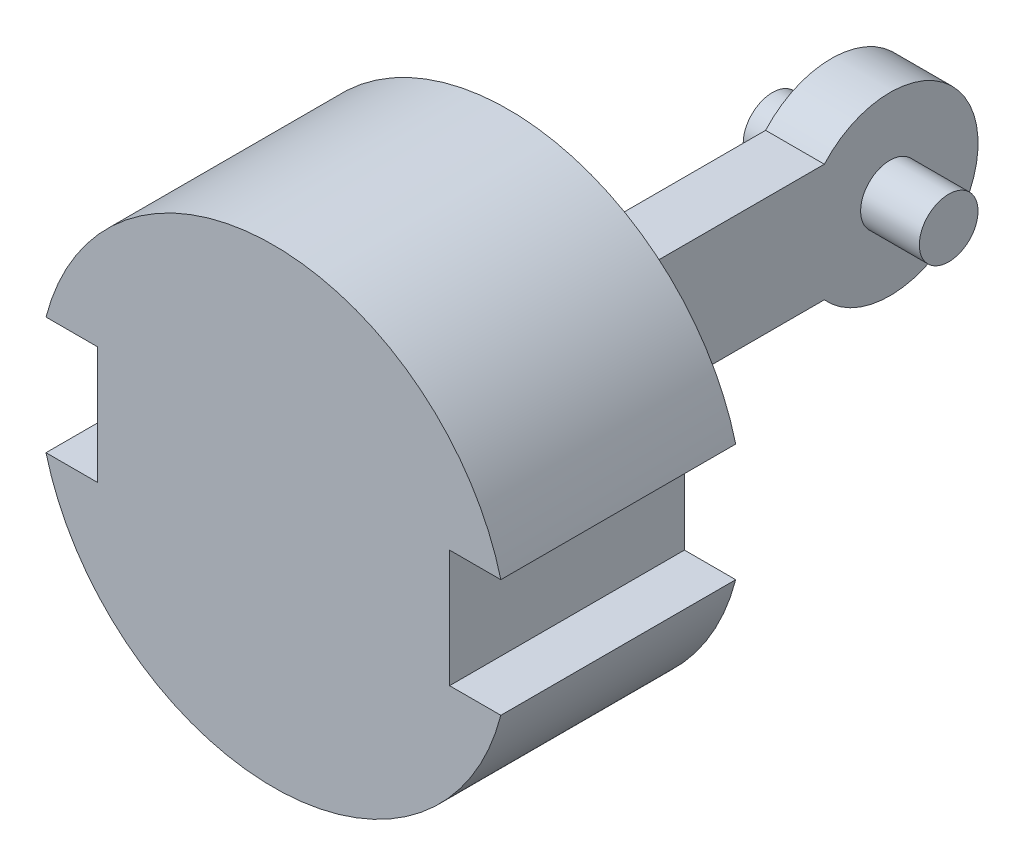
ISO-10303-21;
HEADER;
FILE_DESCRIPTION(('STEP AP214'),'2;1');
FILE_NAME('part.step','',(''),(''),'','','');
FILE_SCHEMA(('AUTOMOTIVE_DESIGN { 1 0 10303 214 1 1 1 1 }'));
ENDSEC;
DATA;
#1=APPLICATION_CONTEXT('core data for automotive mechanical design processes');
#2=APPLICATION_PROTOCOL_DEFINITION('international standard','automotive_design',2000,#1);
#3=PRODUCT_CONTEXT('',#1,'mechanical');
#4=PRODUCT('Part','Part','',(#3));
#5=PRODUCT_RELATED_PRODUCT_CATEGORY('part','',(#4));
#6=PRODUCT_DEFINITION_FORMATION('','',#4);
#7=PRODUCT_DEFINITION_CONTEXT('part definition',#1,'design');
#8=PRODUCT_DEFINITION('design','',#6,#7);
#9=PRODUCT_DEFINITION_SHAPE('','',#8);
#10=(LENGTH_UNIT() NAMED_UNIT(*) SI_UNIT(.MILLI.,.METRE.));
#11=(NAMED_UNIT(*) PLANE_ANGLE_UNIT() SI_UNIT($,.RADIAN.));
#12=(NAMED_UNIT(*) SI_UNIT($,.STERADIAN.) SOLID_ANGLE_UNIT());
#13=UNCERTAINTY_MEASURE_WITH_UNIT(LENGTH_MEASURE(1.E-05),#10,'distance_accuracy_value','');
#14=(GEOMETRIC_REPRESENTATION_CONTEXT(3) GLOBAL_UNCERTAINTY_ASSIGNED_CONTEXT((#13)) GLOBAL_UNIT_ASSIGNED_CONTEXT((#10,
#11,#12)) REPRESENTATION_CONTEXT('',''));
#15=CARTESIAN_POINT('',(0.,0.,0.));
#16=DIRECTION('',(0.,0.,1.));
#17=DIRECTION('',(1.,0.,0.));
#18=AXIS2_PLACEMENT_3D('',#15,#16,#17);
#19=CARTESIAN_POINT('',(-6.35,0.,-127.));
#20=DIRECTION('',(1.,0.,0.));
#21=DIRECTION('',(0.,0.,-1.));
#22=AXIS2_PLACEMENT_3D('',#19,#20,#21);
#23=PLANE('',#22);
#24=CARTESIAN_POINT('',(-6.35,0.,-127.));
#25=DIRECTION('',(1.,0.,0.));
#26=DIRECTION('',(0.,0.,-1.));
#27=AXIS2_PLACEMENT_3D('',#24,#25,#26);
#28=CIRCLE('',#27,19.05);
#29=CARTESIAN_POINT('',(-6.35,-12.7,-112.800968342876));
#30=VERTEX_POINT('',#29);
#31=CARTESIAN_POINT('',(-6.35,12.7,-112.800968342876));
#32=VERTEX_POINT('',#31);
#33=EDGE_CURVE('E431',#30,#32,#28,.T.);
#34=ORIENTED_EDGE('',*,*,#33,.F.);
#35=DIRECTION('',(0.,0.,1.));
#36=VECTOR('',#35,1.);
#37=CARTESIAN_POINT('',(-6.35,-12.7,-127.));
#38=LINE('',#37,#36);
#39=CARTESIAN_POINT('',(-6.35,-12.7,-50.8));
#40=VERTEX_POINT('',#39);
#41=EDGE_CURVE('E51',#30,#40,#38,.T.);
#42=ORIENTED_EDGE('',*,*,#41,.T.);
#43=DIRECTION('',(0.,1.,0.));
#44=VECTOR('',#43,1.);
#45=CARTESIAN_POINT('',(-6.35,0.,-50.8));
#46=LINE('',#45,#44);
#47=CARTESIAN_POINT('',(-6.35,12.7,-50.8));
#48=VERTEX_POINT('',#47);
#49=EDGE_CURVE('E146',#40,#48,#46,.T.);
#50=ORIENTED_EDGE('',*,*,#49,.T.);
#51=DIRECTION('',(0.,0.,1.));
#52=VECTOR('',#51,1.);
#53=CARTESIAN_POINT('',(-6.35,12.7,-127.));
#54=LINE('',#53,#52);
#55=EDGE_CURVE('E438',#32,#48,#54,.T.);
#56=ORIENTED_EDGE('',*,*,#55,.F.);
#57=EDGE_LOOP('',(#34,#42,#50,#56));
#58=FACE_BOUND('',#57,.T.);
#59=CARTESIAN_POINT('',(-6.35,0.,-127.));
#60=DIRECTION('',(1.,0.,0.));
#61=DIRECTION('',(0.,0.,-1.));
#62=AXIS2_PLACEMENT_3D('',#59,#60,#61);
#63=CIRCLE('',#62,6.35);
#64=CARTESIAN_POINT('',(-6.35,0.,-120.65));
#65=VERTEX_POINT('',#64);
#66=EDGE_CURVE('E425',#65,#65,#63,.T.);
#67=ORIENTED_EDGE('',*,*,#66,.T.);
#68=EDGE_LOOP('',(#67));
#69=FACE_BOUND('',#68,.T.);
#70=ADVANCED_FACE('F34',(#58,#69),#23,.F.);
#71=CARTESIAN_POINT('',(6.35,0.,-127.));
#72=DIRECTION('',(1.,0.,0.));
#73=DIRECTION('',(0.,0.,-1.));
#74=AXIS2_PLACEMENT_3D('',#71,#72,#73);
#75=PLANE('',#74);
#76=DIRECTION('',(0.,0.,1.));
#77=VECTOR('',#76,1.);
#78=CARTESIAN_POINT('',(6.35,-12.7,-127.));
#79=LINE('',#78,#77);
#80=CARTESIAN_POINT('',(6.35,-12.7,-112.800968342876));
#81=VERTEX_POINT('',#80);
#82=CARTESIAN_POINT('',(6.35,-12.7,-50.8));
#83=VERTEX_POINT('',#82);
#84=EDGE_CURVE('E122',#81,#83,#79,.T.);
#85=ORIENTED_EDGE('',*,*,#84,.F.);
#86=CARTESIAN_POINT('',(6.35,0.,-127.));
#87=DIRECTION('',(1.,0.,0.));
#88=DIRECTION('',(0.,0.,-1.));
#89=AXIS2_PLACEMENT_3D('',#86,#87,#88);
#90=CIRCLE('',#89,19.05);
#91=CARTESIAN_POINT('',(6.35,12.7,-112.800968342876));
#92=VERTEX_POINT('',#91);
#93=EDGE_CURVE('E428',#81,#92,#90,.T.);
#94=ORIENTED_EDGE('',*,*,#93,.T.);
#95=DIRECTION('',(0.,0.,1.));
#96=VECTOR('',#95,1.);
#97=CARTESIAN_POINT('',(6.35,12.7,-127.));
#98=LINE('',#97,#96);
#99=CARTESIAN_POINT('',(6.35,12.7,-50.8));
#100=VERTEX_POINT('',#99);
#101=EDGE_CURVE('E132',#92,#100,#98,.T.);
#102=ORIENTED_EDGE('',*,*,#101,.T.);
#103=DIRECTION('',(0.,1.,0.));
#104=VECTOR('',#103,1.);
#105=CARTESIAN_POINT('',(6.35,0.,-50.8));
#106=LINE('',#105,#104);
#107=EDGE_CURVE('E135',#83,#100,#106,.T.);
#108=ORIENTED_EDGE('',*,*,#107,.F.);
#109=EDGE_LOOP('',(#85,#94,#102,#108));
#110=FACE_BOUND('',#109,.T.);
#111=CARTESIAN_POINT('',(6.35,0.,-127.));
#112=DIRECTION('',(1.,0.,0.));
#113=DIRECTION('',(0.,0.,-1.));
#114=AXIS2_PLACEMENT_3D('',#111,#112,#113);
#115=CIRCLE('',#114,6.35);
#116=CARTESIAN_POINT('',(6.35,0.,-120.65));
#117=VERTEX_POINT('',#116);
#118=EDGE_CURVE('E422',#117,#117,#115,.T.);
#119=ORIENTED_EDGE('',*,*,#118,.F.);
#120=EDGE_LOOP('',(#119));
#121=FACE_BOUND('',#120,.T.);
#122=ADVANCED_FACE('F136',(#110,#121),#75,.T.);
#123=CARTESIAN_POINT('',(0.,12.7,-50.8));
#124=DIRECTION('',(0.,-1.,0.));
#125=DIRECTION('',(1.,0.,0.));
#126=AXIS2_PLACEMENT_3D('',#123,#124,#125);
#127=PLANE('',#126);
#128=DIRECTION('',(1.,0.,0.));
#129=VECTOR('',#128,1.);
#130=CARTESIAN_POINT('',(0.,12.7,0.));
#131=LINE('',#130,#129);
#132=CARTESIAN_POINT('',(38.1,12.7,0.));
#133=VERTEX_POINT('',#132);
#134=CARTESIAN_POINT('',(49.1868884968342,12.7,0.));
#135=VERTEX_POINT('',#134);
#136=EDGE_CURVE('E172',#133,#135,#131,.T.);
#137=ORIENTED_EDGE('',*,*,#136,.F.);
#138=DIRECTION('',(0.,0.,1.));
#139=VECTOR('',#138,1.);
#140=CARTESIAN_POINT('',(38.1,12.7,-50.8));
#141=LINE('',#140,#139);
#142=CARTESIAN_POINT('',(38.1,12.7,-50.8));
#143=VERTEX_POINT('',#142);
#144=EDGE_CURVE('E11',#143,#133,#141,.T.);
#145=ORIENTED_EDGE('',*,*,#144,.F.);
#146=DIRECTION('',(1.,0.,0.));
#147=VECTOR('',#146,1.);
#148=CARTESIAN_POINT('',(0.,12.7,-50.8));
#149=LINE('',#148,#147);
#150=CARTESIAN_POINT('',(49.1868884968342,12.7,-50.8));
#151=VERTEX_POINT('',#150);
#152=EDGE_CURVE('E152',#143,#151,#149,.T.);
#153=ORIENTED_EDGE('',*,*,#152,.T.);
#154=DIRECTION('',(0.,0.,1.));
#155=VECTOR('',#154,1.);
#156=CARTESIAN_POINT('',(49.1868884968342,12.7,-50.8));
#157=LINE('',#156,#155);
#158=EDGE_CURVE('E38',#151,#135,#157,.T.);
#159=ORIENTED_EDGE('',*,*,#158,.T.);
#160=EDGE_LOOP('',(#137,#145,#153,#159));
#161=FACE_BOUND('',#160,.T.);
#162=ADVANCED_FACE('F36',(#161),#127,.T.);
#163=CARTESIAN_POINT('',(38.1,0.,-50.8));
#164=DIRECTION('',(1.,0.,0.));
#165=DIRECTION('',(0.,0.,-1.));
#166=AXIS2_PLACEMENT_3D('',#163,#164,#165);
#167=PLANE('',#166);
#168=DIRECTION('',(0.,1.,0.));
#169=VECTOR('',#168,1.);
#170=CARTESIAN_POINT('',(38.1,0.,0.));
#171=LINE('',#170,#169);
#172=CARTESIAN_POINT('',(38.1,-12.7,0.));
#173=VERTEX_POINT('',#172);
#174=EDGE_CURVE('E141',#173,#133,#171,.T.);
#175=ORIENTED_EDGE('',*,*,#174,.F.);
#176=DIRECTION('',(0.,0.,1.));
#177=VECTOR('',#176,1.);
#178=CARTESIAN_POINT('',(38.1,-12.7,-50.8));
#179=LINE('',#178,#177);
#180=CARTESIAN_POINT('',(38.1,-12.7,-50.8));
#181=VERTEX_POINT('',#180);
#182=EDGE_CURVE('E43',#181,#173,#179,.T.);
#183=ORIENTED_EDGE('',*,*,#182,.F.);
#184=DIRECTION('',(0.,1.,0.));
#185=VECTOR('',#184,1.);
#186=CARTESIAN_POINT('',(38.1,0.,-50.8));
#187=LINE('',#186,#185);
#188=EDGE_CURVE('E169',#181,#143,#187,.T.);
#189=ORIENTED_EDGE('',*,*,#188,.T.);
#190=ORIENTED_EDGE('',*,*,#144,.T.);
#191=EDGE_LOOP('',(#175,#183,#189,#190));
#192=FACE_BOUND('',#191,.T.);
#193=ADVANCED_FACE('F217',(#192),#167,.T.);
#194=CARTESIAN_POINT('',(0.,-12.7,-50.8));
#195=DIRECTION('',(0.,-1.,0.));
#196=DIRECTION('',(1.,0.,0.));
#197=AXIS2_PLACEMENT_3D('',#194,#195,#196);
#198=PLANE('',#197);
#199=DIRECTION('',(1.,0.,0.));
#200=VECTOR('',#199,1.);
#201=CARTESIAN_POINT('',(0.,-12.7,0.));
#202=LINE('',#201,#200);
#203=CARTESIAN_POINT('',(49.1868884968342,-12.7,0.));
#204=VERTEX_POINT('',#203);
#205=EDGE_CURVE('E188',#173,#204,#202,.T.);
#206=ORIENTED_EDGE('',*,*,#205,.T.);
#207=DIRECTION('',(0.,0.,1.));
#208=VECTOR('',#207,1.);
#209=CARTESIAN_POINT('',(49.1868884968342,-12.7,-50.8));
#210=LINE('',#209,#208);
#211=CARTESIAN_POINT('',(49.1868884968342,-12.7,-50.8));
#212=VERTEX_POINT('',#211);
#213=EDGE_CURVE('E194',#212,#204,#210,.T.);
#214=ORIENTED_EDGE('',*,*,#213,.F.);
#215=DIRECTION('',(1.,0.,0.));
#216=VECTOR('',#215,1.);
#217=CARTESIAN_POINT('',(0.,-12.7,-50.8));
#218=LINE('',#217,#216);
#219=EDGE_CURVE('E167',#181,#212,#218,.T.);
#220=ORIENTED_EDGE('',*,*,#219,.F.);
#221=ORIENTED_EDGE('',*,*,#182,.T.);
#222=EDGE_LOOP('',(#206,#214,#220,#221));
#223=FACE_BOUND('',#222,.T.);
#224=ADVANCED_FACE('F238',(#223),#198,.F.);
#225=CARTESIAN_POINT('',(0.,0.,-50.8));
#226=DIRECTION('',(0.,0.,1.));
#227=DIRECTION('',(1.,0.,0.));
#228=AXIS2_PLACEMENT_3D('',#225,#226,#227);
#229=CYLINDRICAL_SURFACE('',#228,50.8);
#230=CARTESIAN_POINT('',(0.,0.,0.));
#231=DIRECTION('',(0.,0.,1.));
#232=DIRECTION('',(1.,0.,0.));
#233=AXIS2_PLACEMENT_3D('',#230,#231,#232);
#234=CIRCLE('',#233,50.8);
#235=CARTESIAN_POINT('',(-49.1868884968342,-12.7,0.));
#236=VERTEX_POINT('',#235);
#237=EDGE_CURVE('E179',#236,#204,#234,.T.);
#238=ORIENTED_EDGE('',*,*,#237,.F.);
#239=DIRECTION('',(0.,0.,1.));
#240=VECTOR('',#239,1.);
#241=CARTESIAN_POINT('',(-49.1868884968342,-12.7,-50.8));
#242=LINE('',#241,#240);
#243=CARTESIAN_POINT('',(-49.1868884968342,-12.7,-50.8));
#244=VERTEX_POINT('',#243);
#245=EDGE_CURVE('E196',#244,#236,#242,.T.);
#246=ORIENTED_EDGE('',*,*,#245,.F.);
#247=CARTESIAN_POINT('',(0.,0.,-50.8));
#248=DIRECTION('',(0.,0.,1.));
#249=DIRECTION('',(1.,0.,0.));
#250=AXIS2_PLACEMENT_3D('',#247,#248,#249);
#251=CIRCLE('',#250,50.8);
#252=EDGE_CURVE('E159',#244,#212,#251,.T.);
#253=ORIENTED_EDGE('',*,*,#252,.T.);
#254=ORIENTED_EDGE('',*,*,#213,.T.);
#255=EDGE_LOOP('',(#238,#246,#253,#254));
#256=FACE_BOUND('',#255,.T.);
#257=ADVANCED_FACE('F235',(#256),#229,.T.);
#258=CARTESIAN_POINT('',(0.,-12.7,-50.8));
#259=DIRECTION('',(0.,-1.,0.));
#260=DIRECTION('',(1.,0.,0.));
#261=AXIS2_PLACEMENT_3D('',#258,#259,#260);
#262=PLANE('',#261);
#263=DIRECTION('',(1.,0.,0.));
#264=VECTOR('',#263,1.);
#265=CARTESIAN_POINT('',(0.,-12.7,0.));
#266=LINE('',#265,#264);
#267=CARTESIAN_POINT('',(-38.1,-12.7,0.));
#268=VERTEX_POINT('',#267);
#269=EDGE_CURVE('E185',#236,#268,#266,.T.);
#270=ORIENTED_EDGE('',*,*,#269,.T.);
#271=DIRECTION('',(0.,0.,1.));
#272=VECTOR('',#271,1.);
#273=CARTESIAN_POINT('',(-38.1,-12.7,-50.8));
#274=LINE('',#273,#272);
#275=CARTESIAN_POINT('',(-38.1,-12.7,-50.8));
#276=VERTEX_POINT('',#275);
#277=EDGE_CURVE('E198',#276,#268,#274,.T.);
#278=ORIENTED_EDGE('',*,*,#277,.F.);
#279=DIRECTION('',(1.,0.,0.));
#280=VECTOR('',#279,1.);
#281=CARTESIAN_POINT('',(0.,-12.7,-50.8));
#282=LINE('',#281,#280);
#283=EDGE_CURVE('E164',#244,#276,#282,.T.);
#284=ORIENTED_EDGE('',*,*,#283,.F.);
#285=ORIENTED_EDGE('',*,*,#245,.T.);
#286=EDGE_LOOP('',(#270,#278,#284,#285));
#287=FACE_BOUND('',#286,.T.);
#288=ADVANCED_FACE('F231',(#287),#262,.F.);
#289=CARTESIAN_POINT('',(-38.1,0.,-50.8));
#290=DIRECTION('',(1.,0.,0.));
#291=DIRECTION('',(0.,0.,-1.));
#292=AXIS2_PLACEMENT_3D('',#289,#290,#291);
#293=PLANE('',#292);
#294=DIRECTION('',(0.,1.,0.));
#295=VECTOR('',#294,1.);
#296=CARTESIAN_POINT('',(-38.1,0.,0.));
#297=LINE('',#296,#295);
#298=CARTESIAN_POINT('',(-38.1,12.7,0.));
#299=VERTEX_POINT('',#298);
#300=EDGE_CURVE('E182',#268,#299,#297,.T.);
#301=ORIENTED_EDGE('',*,*,#300,.T.);
#302=DIRECTION('',(0.,0.,1.));
#303=VECTOR('',#302,1.);
#304=CARTESIAN_POINT('',(-38.1,12.7,-50.8));
#305=LINE('',#304,#303);
#306=CARTESIAN_POINT('',(-38.1,12.7,-50.8));
#307=VERTEX_POINT('',#306);
#308=EDGE_CURVE('E201',#307,#299,#305,.T.);
#309=ORIENTED_EDGE('',*,*,#308,.F.);
#310=DIRECTION('',(0.,1.,0.));
#311=VECTOR('',#310,1.);
#312=CARTESIAN_POINT('',(-38.1,0.,-50.8));
#313=LINE('',#312,#311);
#314=EDGE_CURVE('E162',#276,#307,#313,.T.);
#315=ORIENTED_EDGE('',*,*,#314,.F.);
#316=ORIENTED_EDGE('',*,*,#277,.T.);
#317=EDGE_LOOP('',(#301,#309,#315,#316));
#318=FACE_BOUND('',#317,.T.);
#319=ADVANCED_FACE('F228',(#318),#293,.F.);
#320=CARTESIAN_POINT('',(0.,12.7,-50.8));
#321=DIRECTION('',(0.,-1.,0.));
#322=DIRECTION('',(1.,0.,0.));
#323=AXIS2_PLACEMENT_3D('',#320,#321,#322);
#324=PLANE('',#323);
#325=DIRECTION('',(1.,0.,0.));
#326=VECTOR('',#325,1.);
#327=CARTESIAN_POINT('',(0.,12.7,0.));
#328=LINE('',#327,#326);
#329=CARTESIAN_POINT('',(-49.1868884968342,12.7,0.));
#330=VERTEX_POINT('',#329);
#331=EDGE_CURVE('E178',#330,#299,#328,.T.);
#332=ORIENTED_EDGE('',*,*,#331,.F.);
#333=DIRECTION('',(0.,0.,1.));
#334=VECTOR('',#333,1.);
#335=CARTESIAN_POINT('',(-49.1868884968342,12.7,-50.8));
#336=LINE('',#335,#334);
#337=CARTESIAN_POINT('',(-49.1868884968342,12.7,-50.8));
#338=VERTEX_POINT('',#337);
#339=EDGE_CURVE('E202',#338,#330,#336,.T.);
#340=ORIENTED_EDGE('',*,*,#339,.F.);
#341=DIRECTION('',(1.,0.,0.));
#342=VECTOR('',#341,1.);
#343=CARTESIAN_POINT('',(0.,12.7,-50.8));
#344=LINE('',#343,#342);
#345=EDGE_CURVE('E158',#338,#307,#344,.T.);
#346=ORIENTED_EDGE('',*,*,#345,.T.);
#347=ORIENTED_EDGE('',*,*,#308,.T.);
#348=EDGE_LOOP('',(#332,#340,#346,#347));
#349=FACE_BOUND('',#348,.T.);
#350=ADVANCED_FACE('F223',(#349),#324,.T.);
#351=EDGE_CURVE('E175',#135,#330,#234,.T.);
#352=ORIENTED_EDGE('',*,*,#351,.F.);
#353=ORIENTED_EDGE('',*,*,#158,.F.);
#354=EDGE_CURVE('E155',#151,#338,#251,.T.);
#355=ORIENTED_EDGE('',*,*,#354,.T.);
#356=ORIENTED_EDGE('',*,*,#339,.T.);
#357=EDGE_LOOP('',(#352,#353,#355,#356));
#358=FACE_BOUND('',#357,.T.);
#359=ADVANCED_FACE('F210',(#358),#229,.T.);
#360=CARTESIAN_POINT('',(0.,0.,-50.8));
#361=DIRECTION('',(0.,0.,1.));
#362=DIRECTION('',(1.,0.,0.));
#363=AXIS2_PLACEMENT_3D('',#360,#361,#362);
#364=PLANE('',#363);
#365=ORIENTED_EDGE('',*,*,#107,.T.);
#366=DIRECTION('',(1.,0.,0.));
#367=VECTOR('',#366,1.);
#368=CARTESIAN_POINT('',(0.,12.7,-50.8));
#369=LINE('',#368,#367);
#370=EDGE_CURVE('E148',#48,#100,#369,.T.);
#371=ORIENTED_EDGE('',*,*,#370,.F.);
#372=ORIENTED_EDGE('',*,*,#49,.F.);
#373=DIRECTION('',(1.,0.,0.));
#374=VECTOR('',#373,1.);
#375=CARTESIAN_POINT('',(0.,-12.7,-50.8));
#376=LINE('',#375,#374);
#377=EDGE_CURVE('E126',#40,#83,#376,.T.);
#378=ORIENTED_EDGE('',*,*,#377,.T.);
#379=EDGE_LOOP('',(#365,#371,#372,#378));
#380=FACE_BOUND('',#379,.T.);
#381=ORIENTED_EDGE('',*,*,#152,.F.);
#382=ORIENTED_EDGE('',*,*,#188,.F.);
#383=ORIENTED_EDGE('',*,*,#219,.T.);
#384=ORIENTED_EDGE('',*,*,#252,.F.);
#385=ORIENTED_EDGE('',*,*,#283,.T.);
#386=ORIENTED_EDGE('',*,*,#314,.T.);
#387=ORIENTED_EDGE('',*,*,#345,.F.);
#388=ORIENTED_EDGE('',*,*,#354,.F.);
#389=EDGE_LOOP('',(#381,#382,#383,#384,#385,#386,#387,#388));
#390=FACE_BOUND('',#389,.T.);
#391=ADVANCED_FACE('F143',(#380,#390),#364,.F.);
#392=CARTESIAN_POINT('',(0.,0.,0.));
#393=DIRECTION('',(0.,0.,1.));
#394=DIRECTION('',(1.,0.,0.));
#395=AXIS2_PLACEMENT_3D('',#392,#393,#394);
#396=PLANE('',#395);
#397=ORIENTED_EDGE('',*,*,#136,.T.);
#398=ORIENTED_EDGE('',*,*,#351,.T.);
#399=ORIENTED_EDGE('',*,*,#331,.T.);
#400=ORIENTED_EDGE('',*,*,#300,.F.);
#401=ORIENTED_EDGE('',*,*,#269,.F.);
#402=ORIENTED_EDGE('',*,*,#237,.T.);
#403=ORIENTED_EDGE('',*,*,#205,.F.);
#404=ORIENTED_EDGE('',*,*,#174,.T.);
#405=EDGE_LOOP('',(#397,#398,#399,#400,#401,#402,#403,#404));
#406=FACE_BOUND('',#405,.T.);
#407=ADVANCED_FACE('F212',(#406),#396,.T.);
#408=CARTESIAN_POINT('',(0.,-12.7,-127.));
#409=DIRECTION('',(0.,-1.,0.));
#410=DIRECTION('',(0.,0.,-1.));
#411=AXIS2_PLACEMENT_3D('',#408,#409,#410);
#412=PLANE('',#411);
#413=DIRECTION('',(1.,0.,0.));
#414=VECTOR('',#413,1.);
#415=CARTESIAN_POINT('',(-6.35,-12.7,-112.800968342876));
#416=LINE('',#415,#414);
#417=EDGE_CURVE('E128',#81,#30,#416,.F.);
#418=ORIENTED_EDGE('',*,*,#417,.F.);
#419=ORIENTED_EDGE('',*,*,#84,.T.);
#420=ORIENTED_EDGE('',*,*,#377,.F.);
#421=ORIENTED_EDGE('',*,*,#41,.F.);
#422=EDGE_LOOP('',(#418,#419,#420,#421));
#423=FACE_BOUND('',#422,.T.);
#424=ADVANCED_FACE('F124',(#423),#412,.T.);
#425=CARTESIAN_POINT('',(0.,12.7,-127.));
#426=DIRECTION('',(0.,-1.,0.));
#427=DIRECTION('',(0.,0.,-1.));
#428=AXIS2_PLACEMENT_3D('',#425,#426,#427);
#429=PLANE('',#428);
#430=ORIENTED_EDGE('',*,*,#101,.F.);
#431=DIRECTION('',(1.,0.,0.));
#432=VECTOR('',#431,1.);
#433=CARTESIAN_POINT('',(-6.35,12.7,-112.800968342876));
#434=LINE('',#433,#432);
#435=EDGE_CURVE('E59',#92,#32,#434,.F.);
#436=ORIENTED_EDGE('',*,*,#435,.T.);
#437=ORIENTED_EDGE('',*,*,#55,.T.);
#438=ORIENTED_EDGE('',*,*,#370,.T.);
#439=EDGE_LOOP('',(#430,#436,#437,#438));
#440=FACE_BOUND('',#439,.T.);
#441=ADVANCED_FACE('F260',(#440),#429,.F.);
#442=CARTESIAN_POINT('',(-6.35,0.,-127.));
#443=DIRECTION('',(1.,0.,0.));
#444=DIRECTION('',(0.,0.,-1.));
#445=AXIS2_PLACEMENT_3D('',#442,#443,#444);
#446=CYLINDRICAL_SURFACE('',#445,19.05);
#447=ORIENTED_EDGE('',*,*,#93,.F.);
#448=ORIENTED_EDGE('',*,*,#417,.T.);
#449=ORIENTED_EDGE('',*,*,#33,.T.);
#450=ORIENTED_EDGE('',*,*,#435,.F.);
#451=EDGE_LOOP('',(#447,#448,#449,#450));
#452=FACE_BOUND('',#451,.T.);
#453=ADVANCED_FACE('F258',(#452),#446,.T.);
#454=CARTESIAN_POINT('',(19.05,0.,0.));
#455=DIRECTION('',(1.,0.,0.));
#456=DIRECTION('',(0.,0.,-1.));
#457=AXIS2_PLACEMENT_3D('',#454,#455,#456);
#458=PLANE('',#457);
#459=CARTESIAN_POINT('',(19.05,0.,-127.));
#460=DIRECTION('',(1.,0.,0.));
#461=DIRECTION('',(0.,0.,-1.));
#462=AXIS2_PLACEMENT_3D('',#459,#460,#461);
#463=CIRCLE('',#462,6.35);
#464=CARTESIAN_POINT('',(19.05,0.,-120.65));
#465=VERTEX_POINT('',#464);
#466=EDGE_CURVE('E419',#465,#465,#463,.T.);
#467=ORIENTED_EDGE('',*,*,#466,.T.);
#468=EDGE_LOOP('',(#467));
#469=FACE_BOUND('',#468,.T.);
#470=ADVANCED_FACE('F287',(#469),#458,.T.);
#471=CARTESIAN_POINT('',(19.05,0.,-127.));
#472=DIRECTION('',(-1.,0.,0.));
#473=DIRECTION('',(0.,0.,1.));
#474=AXIS2_PLACEMENT_3D('',#471,#472,#473);
#475=CYLINDRICAL_SURFACE('',#474,6.35);
#476=CARTESIAN_POINT('',(6.35,0.,-120.65));
#477=CARTESIAN_POINT('',(6.48229166666666,0.,-120.65));
#478=CARTESIAN_POINT('',(6.61458333333333,0.,-120.65));
#479=CARTESIAN_POINT('',(6.87916666666666,0.,-120.65));
#480=CARTESIAN_POINT('',(7.01145833333333,0.,-120.65));
#481=CARTESIAN_POINT('',(7.27604166666666,0.,-120.65));
#482=CARTESIAN_POINT('',(7.40833333333333,0.,-120.65));
#483=CARTESIAN_POINT('',(7.67291666666666,0.,-120.65));
#484=CARTESIAN_POINT('',(7.80520833333333,0.,-120.65));
#485=CARTESIAN_POINT('',(8.06979166666666,0.,-120.65));
#486=CARTESIAN_POINT('',(8.20208333333333,0.,-120.65));
#487=CARTESIAN_POINT('',(8.46666666666666,0.,-120.65));
#488=CARTESIAN_POINT('',(8.59895833333333,0.,-120.65));
#489=CARTESIAN_POINT('',(8.86354166666666,0.,-120.65));
#490=CARTESIAN_POINT('',(8.99583333333333,0.,-120.65));
#491=CARTESIAN_POINT('',(9.26041666666666,0.,-120.65));
#492=CARTESIAN_POINT('',(9.39270833333333,0.,-120.65));
#493=CARTESIAN_POINT('',(9.65729166666666,0.,-120.65));
#494=CARTESIAN_POINT('',(9.78958333333333,0.,-120.65));
#495=CARTESIAN_POINT('',(10.0541666666667,0.,-120.65));
#496=CARTESIAN_POINT('',(10.1864583333333,0.,-120.65));
#497=CARTESIAN_POINT('',(10.4510416666667,0.,-120.65));
#498=CARTESIAN_POINT('',(10.5833333333333,0.,-120.65));
#499=CARTESIAN_POINT('',(10.8479166666667,0.,-120.65));
#500=CARTESIAN_POINT('',(10.9802083333333,0.,-120.65));
#501=CARTESIAN_POINT('',(11.2447916666667,0.,-120.65));
#502=CARTESIAN_POINT('',(11.3770833333333,0.,-120.65));
#503=CARTESIAN_POINT('',(11.6416666666667,0.,-120.65));
#504=CARTESIAN_POINT('',(11.7739583333333,0.,-120.65));
#505=CARTESIAN_POINT('',(12.0385416666667,0.,-120.65));
#506=CARTESIAN_POINT('',(12.1708333333333,0.,-120.65));
#507=CARTESIAN_POINT('',(12.4354166666667,0.,-120.65));
#508=CARTESIAN_POINT('',(12.5677083333333,0.,-120.65));
#509=CARTESIAN_POINT('',(12.8322916666667,0.,-120.65));
#510=CARTESIAN_POINT('',(12.9645833333333,0.,-120.65));
#511=CARTESIAN_POINT('',(13.2291666666667,0.,-120.65));
#512=CARTESIAN_POINT('',(13.3614583333333,0.,-120.65));
#513=CARTESIAN_POINT('',(13.6260416666667,0.,-120.65));
#514=CARTESIAN_POINT('',(13.7583333333333,0.,-120.65));
#515=CARTESIAN_POINT('',(14.0229166666667,0.,-120.65));
#516=CARTESIAN_POINT('',(14.1552083333333,0.,-120.65));
#517=CARTESIAN_POINT('',(14.4197916666667,0.,-120.65));
#518=CARTESIAN_POINT('',(14.5520833333333,0.,-120.65));
#519=CARTESIAN_POINT('',(14.8166666666667,0.,-120.65));
#520=CARTESIAN_POINT('',(14.9489583333333,0.,-120.65));
#521=CARTESIAN_POINT('',(15.2135416666667,0.,-120.65));
#522=CARTESIAN_POINT('',(15.3458333333333,0.,-120.65));
#523=CARTESIAN_POINT('',(15.6104166666667,0.,-120.65));
#524=CARTESIAN_POINT('',(15.7427083333333,0.,-120.65));
#525=CARTESIAN_POINT('',(16.0072916666667,0.,-120.65));
#526=CARTESIAN_POINT('',(16.1395833333333,0.,-120.65));
#527=CARTESIAN_POINT('',(16.4041666666667,0.,-120.65));
#528=CARTESIAN_POINT('',(16.5364583333333,0.,-120.65));
#529=CARTESIAN_POINT('',(16.8010416666667,0.,-120.65));
#530=CARTESIAN_POINT('',(16.9333333333333,0.,-120.65));
#531=CARTESIAN_POINT('',(17.1979166666667,0.,-120.65));
#532=CARTESIAN_POINT('',(17.3302083333333,0.,-120.65));
#533=CARTESIAN_POINT('',(17.5947916666667,0.,-120.65));
#534=CARTESIAN_POINT('',(17.7270833333333,0.,-120.65));
#535=CARTESIAN_POINT('',(17.9916666666667,0.,-120.65));
#536=CARTESIAN_POINT('',(18.1239583333333,0.,-120.65));
#537=CARTESIAN_POINT('',(18.3885416666667,0.,-120.65));
#538=CARTESIAN_POINT('',(18.5208333333333,0.,-120.65));
#539=CARTESIAN_POINT('',(18.7854166666667,0.,-120.65));
#540=CARTESIAN_POINT('',(18.9177083333333,0.,-120.65));
#541=CARTESIAN_POINT('',(19.05,0.,-120.65));
#542=B_SPLINE_CURVE_WITH_KNOTS('',3,(#476,#477,#478,#479,#480,#481,#482,#483,#484,#485,#486,
#487,#488,#489,#490,#491,#492,#493,#494,#495,#496,#497,#498,#499,#500,#501,#502,#503,#504,#505,
#506,#507,#508,#509,#510,#511,#512,#513,#514,#515,#516,#517,#518,#519,#520,#521,#522,#523,#524,
#525,#526,#527,#528,#529,#530,#531,#532,#533,#534,#535,#536,#537,#538,#539,#540,#541),
.UNSPECIFIED.,.F.,.F.,(4,2,2,2,2,2,2,2,2,2,2,2,2,2,2,2,2,2,2,2,2,2,2,2,2,2,2,2,2,2,2,2,4),(0.,
0.396875,0.793749999999999,1.190625,1.5875,1.984375,2.38125,2.778125,3.175,3.571875,3.96875,
4.365625,4.7625,5.159375,5.55625,5.953125,6.35,6.746875,7.14375,7.540625,7.9375,8.334375,
8.73125,9.128125,9.525,9.921875,10.31875,10.715625,11.1125,11.509375,11.90625,12.303125,12.7),.UNSPECIFIED.);
#543=EDGE_CURVE('BSEAM294',#117,#465,#542,.T.);
#544=ORIENTED_EDGE('',*,*,#118,.T.);
#545=ORIENTED_EDGE('',*,*,#466,.F.);
#546=ORIENTED_EDGE('',*,*,#543,.T.);
#547=ORIENTED_EDGE('',*,*,#543,.F.);
#548=EDGE_LOOP('',(#544,#546,#545,#547));
#549=FACE_BOUND('',#548,.T.);
#550=ADVANCED_FACE('F294',(#549),#475,.T.);
#551=CARTESIAN_POINT('',(-19.05,0.,-127.));
#552=DIRECTION('',(1.,0.,0.));
#553=DIRECTION('',(0.,0.,-1.));
#554=AXIS2_PLACEMENT_3D('',#551,#552,#553);
#555=CIRCLE('',#554,6.35);
#556=CARTESIAN_POINT('',(-19.05,0.,-120.65));
#557=VERTEX_POINT('',#556);
#558=EDGE_CURVE('E418',#557,#557,#555,.T.);
#559=CARTESIAN_POINT('',(-19.05,0.,-120.65));
#560=CARTESIAN_POINT('',(-18.9177083333333,0.,-120.65));
#561=CARTESIAN_POINT('',(-18.7854166666667,0.,-120.65));
#562=CARTESIAN_POINT('',(-18.5208333333333,0.,-120.65));
#563=CARTESIAN_POINT('',(-18.3885416666667,0.,-120.65));
#564=CARTESIAN_POINT('',(-18.1239583333333,0.,-120.65));
#565=CARTESIAN_POINT('',(-17.9916666666667,0.,-120.65));
#566=CARTESIAN_POINT('',(-17.7270833333333,0.,-120.65));
#567=CARTESIAN_POINT('',(-17.5947916666667,0.,-120.65));
#568=CARTESIAN_POINT('',(-17.3302083333333,0.,-120.65));
#569=CARTESIAN_POINT('',(-17.1979166666667,0.,-120.65));
#570=CARTESIAN_POINT('',(-16.9333333333333,0.,-120.65));
#571=CARTESIAN_POINT('',(-16.8010416666667,0.,-120.65));
#572=CARTESIAN_POINT('',(-16.5364583333333,0.,-120.65));
#573=CARTESIAN_POINT('',(-16.4041666666667,0.,-120.65));
#574=CARTESIAN_POINT('',(-16.1395833333333,0.,-120.65));
#575=CARTESIAN_POINT('',(-16.0072916666667,0.,-120.65));
#576=CARTESIAN_POINT('',(-15.7427083333333,0.,-120.65));
#577=CARTESIAN_POINT('',(-15.6104166666667,0.,-120.65));
#578=CARTESIAN_POINT('',(-15.3458333333333,0.,-120.65));
#579=CARTESIAN_POINT('',(-15.2135416666667,0.,-120.65));
#580=CARTESIAN_POINT('',(-14.9489583333333,0.,-120.65));
#581=CARTESIAN_POINT('',(-14.8166666666667,0.,-120.65));
#582=CARTESIAN_POINT('',(-14.5520833333333,0.,-120.65));
#583=CARTESIAN_POINT('',(-14.4197916666667,0.,-120.65));
#584=CARTESIAN_POINT('',(-14.1552083333333,0.,-120.65));
#585=CARTESIAN_POINT('',(-14.0229166666667,0.,-120.65));
#586=CARTESIAN_POINT('',(-13.7583333333333,0.,-120.65));
#587=CARTESIAN_POINT('',(-13.6260416666667,0.,-120.65));
#588=CARTESIAN_POINT('',(-13.3614583333333,0.,-120.65));
#589=CARTESIAN_POINT('',(-13.2291666666667,0.,-120.65));
#590=CARTESIAN_POINT('',(-12.9645833333333,0.,-120.65));
#591=CARTESIAN_POINT('',(-12.8322916666667,0.,-120.65));
#592=CARTESIAN_POINT('',(-12.5677083333333,0.,-120.65));
#593=CARTESIAN_POINT('',(-12.4354166666667,0.,-120.65));
#594=CARTESIAN_POINT('',(-12.1708333333333,0.,-120.65));
#595=CARTESIAN_POINT('',(-12.0385416666667,0.,-120.65));
#596=CARTESIAN_POINT('',(-11.7739583333333,0.,-120.65));
#597=CARTESIAN_POINT('',(-11.6416666666667,0.,-120.65));
#598=CARTESIAN_POINT('',(-11.3770833333333,0.,-120.65));
#599=CARTESIAN_POINT('',(-11.2447916666667,0.,-120.65));
#600=CARTESIAN_POINT('',(-10.9802083333333,0.,-120.65));
#601=CARTESIAN_POINT('',(-10.8479166666667,0.,-120.65));
#602=CARTESIAN_POINT('',(-10.5833333333333,0.,-120.65));
#603=CARTESIAN_POINT('',(-10.4510416666667,0.,-120.65));
#604=CARTESIAN_POINT('',(-10.1864583333333,0.,-120.65));
#605=CARTESIAN_POINT('',(-10.0541666666667,0.,-120.65));
#606=CARTESIAN_POINT('',(-9.78958333333334,0.,-120.65));
#607=CARTESIAN_POINT('',(-9.65729166666667,0.,-120.65));
#608=CARTESIAN_POINT('',(-9.39270833333334,0.,-120.65));
#609=CARTESIAN_POINT('',(-9.26041666666667,0.,-120.65));
#610=CARTESIAN_POINT('',(-8.99583333333334,0.,-120.65));
#611=CARTESIAN_POINT('',(-8.86354166666667,0.,-120.65));
#612=CARTESIAN_POINT('',(-8.59895833333334,0.,-120.65));
#613=CARTESIAN_POINT('',(-8.46666666666667,0.,-120.65));
#614=CARTESIAN_POINT('',(-8.20208333333334,0.,-120.65));
#615=CARTESIAN_POINT('',(-8.06979166666667,0.,-120.65));
#616=CARTESIAN_POINT('',(-7.80520833333334,0.,-120.65));
#617=CARTESIAN_POINT('',(-7.67291666666667,0.,-120.65));
#618=CARTESIAN_POINT('',(-7.40833333333334,0.,-120.65));
#619=CARTESIAN_POINT('',(-7.27604166666667,0.,-120.65));
#620=CARTESIAN_POINT('',(-7.01145833333334,0.,-120.65));
#621=CARTESIAN_POINT('',(-6.87916666666667,0.,-120.65));
#622=CARTESIAN_POINT('',(-6.61458333333334,0.,-120.65));
#623=CARTESIAN_POINT('',(-6.48229166666667,0.,-120.65));
#624=CARTESIAN_POINT('',(-6.35,0.,-120.65));
#625=B_SPLINE_CURVE_WITH_KNOTS('',3,(#559,#560,#561,#562,#563,#564,#565,#566,#567,#568,#569,
#570,#571,#572,#573,#574,#575,#576,#577,#578,#579,#580,#581,#582,#583,#584,#585,#586,#587,#588,
#589,#590,#591,#592,#593,#594,#595,#596,#597,#598,#599,#600,#601,#602,#603,#604,#605,#606,#607,
#608,#609,#610,#611,#612,#613,#614,#615,#616,#617,#618,#619,#620,#621,#622,#623,#624),
.UNSPECIFIED.,.F.,.F.,(4,2,2,2,2,2,2,2,2,2,2,2,2,2,2,2,2,2,2,2,2,2,2,2,2,2,2,2,2,2,2,2,4),(0.,
0.396874999999998,0.793750000000003,1.190625,1.5875,1.984375,2.38125,2.778125,3.175,3.571875,
3.96875,4.365625,4.7625,5.159375,5.55625,5.953125,6.35,6.746875,7.14375,7.540625,7.9375,
8.334375,8.73125,9.128125,9.525,9.921875,10.31875,10.715625,11.1125,11.509375,11.90625,
12.303125,12.7),.UNSPECIFIED.);
#626=EDGE_CURVE('BSEAM303',#557,#65,#625,.T.);
#627=ORIENTED_EDGE('',*,*,#558,.T.);
#628=ORIENTED_EDGE('',*,*,#66,.F.);
#629=ORIENTED_EDGE('',*,*,#626,.T.);
#630=ORIENTED_EDGE('',*,*,#626,.F.);
#631=EDGE_LOOP('',(#627,#629,#628,#630));
#632=FACE_BOUND('',#631,.T.);
#633=ADVANCED_FACE('F303',(#632),#475,.T.);
#634=CARTESIAN_POINT('',(-19.05,0.,0.));
#635=DIRECTION('',(1.,0.,0.));
#636=DIRECTION('',(0.,0.,-1.));
#637=AXIS2_PLACEMENT_3D('',#634,#635,#636);
#638=PLANE('',#637);
#639=ORIENTED_EDGE('',*,*,#558,.F.);
#640=EDGE_LOOP('',(#639));
#641=FACE_BOUND('',#640,.T.);
#642=ADVANCED_FACE('F310',(#641),#638,.F.);
#643=CLOSED_SHELL('',(#70,#122,#162,#193,#224,#257,#288,#319,#350,#359,#391,#407,#424,#441,#453,
#470,#550,#633,#642));
#644=MANIFOLD_SOLID_BREP('B2',#643);
#645=ADVANCED_BREP_SHAPE_REPRESENTATION('',(#18,#644),#14);
#646=SHAPE_DEFINITION_REPRESENTATION(#9,#645);
ENDSEC;
END-ISO-10303-21;
